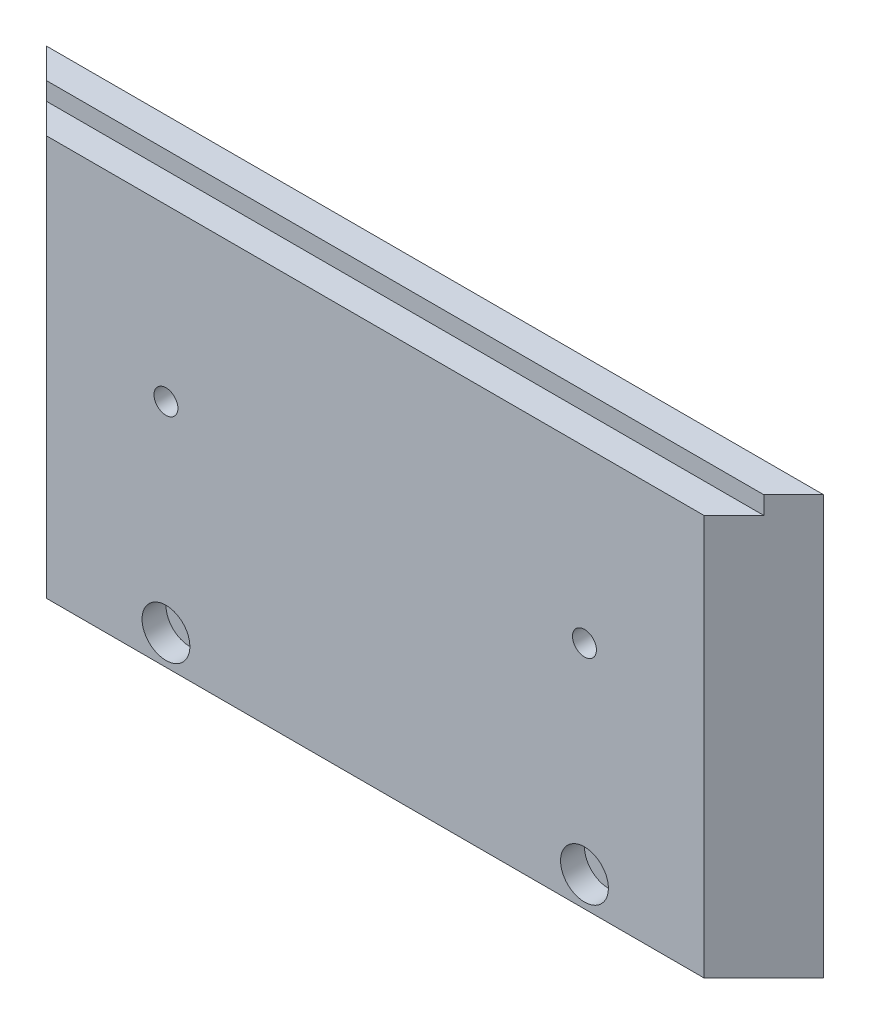
ISO-10303-21;
HEADER;
FILE_DESCRIPTION(('STEP AP214'),'2;1');
FILE_NAME('part.step','',(''),(''),'','','');
FILE_SCHEMA(('AUTOMOTIVE_DESIGN { 1 0 10303 214 1 1 1 1 }'));
ENDSEC;
DATA;
#1=APPLICATION_CONTEXT('core data for automotive mechanical design processes');
#2=APPLICATION_PROTOCOL_DEFINITION('international standard','automotive_design',2000,#1);
#3=PRODUCT_CONTEXT('',#1,'mechanical');
#4=PRODUCT('Part','Part','',(#3));
#5=PRODUCT_RELATED_PRODUCT_CATEGORY('part','',(#4));
#6=PRODUCT_DEFINITION_FORMATION('','',#4);
#7=PRODUCT_DEFINITION_CONTEXT('part definition',#1,'design');
#8=PRODUCT_DEFINITION('design','',#6,#7);
#9=PRODUCT_DEFINITION_SHAPE('','',#8);
#10=(LENGTH_UNIT() NAMED_UNIT(*) SI_UNIT(.MILLI.,.METRE.));
#11=(NAMED_UNIT(*) PLANE_ANGLE_UNIT() SI_UNIT($,.RADIAN.));
#12=(NAMED_UNIT(*) SI_UNIT($,.STERADIAN.) SOLID_ANGLE_UNIT());
#13=UNCERTAINTY_MEASURE_WITH_UNIT(LENGTH_MEASURE(1.E-05),#10,'distance_accuracy_value','');
#14=(GEOMETRIC_REPRESENTATION_CONTEXT(3) GLOBAL_UNCERTAINTY_ASSIGNED_CONTEXT((#13)) GLOBAL_UNIT_ASSIGNED_CONTEXT((#10,
#11,#12)) REPRESENTATION_CONTEXT('',''));
#15=CARTESIAN_POINT('',(0.,0.,0.));
#16=DIRECTION('',(0.,0.,1.));
#17=DIRECTION('',(1.,0.,0.));
#18=AXIS2_PLACEMENT_3D('',#15,#16,#17);
#19=CARTESIAN_POINT('',(0.,70.,0.));
#20=DIRECTION('',(0.,0.,-1.));
#21=DIRECTION('',(-1.,0.,0.));
#22=AXIS2_PLACEMENT_3D('',#19,#20,#21);
#23=PLANE('',#22);
#24=CARTESIAN_POINT('',(30.,38.5,0.));
#25=DIRECTION('',(0.,0.,1.));
#26=DIRECTION('',(1.,0.,0.));
#27=AXIS2_PLACEMENT_3D('',#24,#25,#26);
#28=CIRCLE('',#27,2.);
#29=CARTESIAN_POINT('',(32.,38.5,0.));
#30=VERTEX_POINT('',#29);
#31=EDGE_CURVE('E149',#30,#30,#28,.T.);
#32=ORIENTED_EDGE('',*,*,#31,.F.);
#33=EDGE_LOOP('',(#32));
#34=FACE_BOUND('',#33,.T.);
#35=CARTESIAN_POINT('',(100.,38.5,0.));
#36=DIRECTION('',(0.,0.,1.));
#37=DIRECTION('',(1.,0.,0.));
#38=AXIS2_PLACEMENT_3D('',#35,#36,#37);
#39=CIRCLE('',#38,2.);
#40=CARTESIAN_POINT('',(102.,38.5,0.));
#41=VERTEX_POINT('',#40);
#42=EDGE_CURVE('E146',#41,#41,#39,.T.);
#43=ORIENTED_EDGE('',*,*,#42,.F.);
#44=EDGE_LOOP('',(#43));
#45=FACE_BOUND('',#44,.T.);
#46=CARTESIAN_POINT('',(30.,5.,0.));
#47=DIRECTION('',(0.,0.,1.));
#48=DIRECTION('',(1.,0.,0.));
#49=AXIS2_PLACEMENT_3D('',#46,#47,#48);
#50=CIRCLE('',#49,4.00000000000001);
#51=CARTESIAN_POINT('',(34.,5.,0.));
#52=VERTEX_POINT('',#51);
#53=EDGE_CURVE('E138',#52,#52,#50,.T.);
#54=ORIENTED_EDGE('',*,*,#53,.F.);
#55=EDGE_LOOP('',(#54));
#56=FACE_BOUND('',#55,.T.);
#57=CARTESIAN_POINT('',(100.,5.,0.));
#58=DIRECTION('',(0.,0.,1.));
#59=DIRECTION('',(1.,0.,0.));
#60=AXIS2_PLACEMENT_3D('',#57,#58,#59);
#61=CIRCLE('',#60,4.00000000000001);
#62=CARTESIAN_POINT('',(104.,5.,0.));
#63=VERTEX_POINT('',#62);
#64=EDGE_CURVE('E131',#63,#63,#61,.T.);
#65=ORIENTED_EDGE('',*,*,#64,.F.);
#66=EDGE_LOOP('',(#65));
#67=FACE_BOUND('',#66,.T.);
#68=DIRECTION('',(1.,0.,0.));
#69=VECTOR('',#68,1.);
#70=CARTESIAN_POINT('',(0.,67.,0.));
#71=LINE('',#70,#69);
#72=CARTESIAN_POINT('',(10.,67.,0.));
#73=VERTEX_POINT('',#72);
#74=CARTESIAN_POINT('',(120.,67.,0.));
#75=VERTEX_POINT('',#74);
#76=EDGE_CURVE('E122',#73,#75,#71,.T.);
#77=ORIENTED_EDGE('',*,*,#76,.F.);
#78=DIRECTION('',(0.,-1.,0.));
#79=VECTOR('',#78,1.);
#80=CARTESIAN_POINT('',(10.,70.,0.));
#81=LINE('',#80,#79);
#82=CARTESIAN_POINT('',(10.,0.,0.));
#83=VERTEX_POINT('',#82);
#84=EDGE_CURVE('E86',#73,#83,#81,.T.);
#85=ORIENTED_EDGE('',*,*,#84,.T.);
#86=DIRECTION('',(1.,0.,0.));
#87=VECTOR('',#86,1.);
#88=CARTESIAN_POINT('',(0.,0.,0.));
#89=LINE('',#88,#87);
#90=CARTESIAN_POINT('',(120.,0.,0.));
#91=VERTEX_POINT('',#90);
#92=EDGE_CURVE('E90',#83,#91,#89,.T.);
#93=ORIENTED_EDGE('',*,*,#92,.T.);
#94=DIRECTION('',(0.,-1.,0.));
#95=VECTOR('',#94,1.);
#96=CARTESIAN_POINT('',(120.,70.,0.));
#97=LINE('',#96,#95);
#98=EDGE_CURVE('E76',#75,#91,#97,.T.);
#99=ORIENTED_EDGE('',*,*,#98,.F.);
#100=EDGE_LOOP('',(#77,#85,#93,#99));
#101=FACE_BOUND('',#100,.T.);
#102=ADVANCED_FACE('F33',(#34,#45,#56,#67,#101),#23,.F.);
#103=CARTESIAN_POINT('',(60.0000000000011,70.,60.0000000000001));
#104=DIRECTION('',(0.707106781186554,0.,0.707106781186541));
#105=DIRECTION('',(0.707106781186541,0.,-0.707106781186554));
#106=AXIS2_PLACEMENT_3D('',#103,#104,#105);
#107=PLANE('',#106);
#108=DIRECTION('',(0.,-1.,0.));
#109=VECTOR('',#108,1.);
#110=CARTESIAN_POINT('',(125.,70.000012,-5.));
#111=LINE('',#110,#109);
#112=CARTESIAN_POINT('',(125.,70.,-5.));
#113=VERTEX_POINT('',#112);
#114=CARTESIAN_POINT('',(125.,67.,-5.));
#115=VERTEX_POINT('',#114);
#116=EDGE_CURVE('E47',#113,#115,#111,.T.);
#117=ORIENTED_EDGE('',*,*,#116,.T.);
#118=DIRECTION('',(0.707106781186541,0.,-0.707106781186554));
#119=VECTOR('',#118,1.);
#120=CARTESIAN_POINT('',(60.0000000000012,67.,60.0000000000001));
#121=LINE('',#120,#119);
#122=EDGE_CURVE('E83',#75,#115,#121,.T.);
#123=ORIENTED_EDGE('',*,*,#122,.F.);
#124=ORIENTED_EDGE('',*,*,#98,.T.);
#125=DIRECTION('',(-0.707106781186541,0.,0.707106781186554));
#126=VECTOR('',#125,1.);
#127=CARTESIAN_POINT('',(60.0000000000011,0.,60.0000000000001));
#128=LINE('',#127,#126);
#129=CARTESIAN_POINT('',(130.,0.,-10.));
#130=VERTEX_POINT('',#129);
#131=EDGE_CURVE('E79',#130,#91,#128,.T.);
#132=ORIENTED_EDGE('',*,*,#131,.F.);
#133=DIRECTION('',(0.,-1.,0.));
#134=VECTOR('',#133,1.);
#135=CARTESIAN_POINT('',(130.,70.,-10.));
#136=LINE('',#135,#134);
#137=CARTESIAN_POINT('',(130.,70.,-10.));
#138=VERTEX_POINT('',#137);
#139=EDGE_CURVE('E41',#138,#130,#136,.T.);
#140=ORIENTED_EDGE('',*,*,#139,.F.);
#141=DIRECTION('',(-0.707106781186541,0.,0.707106781186554));
#142=VECTOR('',#141,1.);
#143=CARTESIAN_POINT('',(60.0000000000011,70.,60.0000000000001));
#144=LINE('',#143,#142);
#145=EDGE_CURVE('E95',#138,#113,#144,.T.);
#146=ORIENTED_EDGE('',*,*,#145,.T.);
#147=EDGE_LOOP('',(#117,#123,#124,#132,#140,#146));
#148=FACE_BOUND('',#147,.T.);
#149=ADVANCED_FACE('F35',(#148),#107,.T.);
#150=CARTESIAN_POINT('',(0.,70.,-10.));
#151=DIRECTION('',(0.,0.,-1.));
#152=DIRECTION('',(-1.,0.,0.));
#153=AXIS2_PLACEMENT_3D('',#150,#151,#152);
#154=PLANE('',#153);
#155=DIRECTION('',(1.,0.,0.));
#156=VECTOR('',#155,1.);
#157=CARTESIAN_POINT('',(0.,0.,-10.));
#158=LINE('',#157,#156);
#159=CARTESIAN_POINT('',(0.,0.,-10.));
#160=VERTEX_POINT('',#159);
#161=EDGE_CURVE('E99',#160,#130,#158,.T.);
#162=ORIENTED_EDGE('',*,*,#161,.F.);
#163=DIRECTION('',(0.,-1.,0.));
#164=VECTOR('',#163,1.);
#165=CARTESIAN_POINT('',(0.,70.,-10.));
#166=LINE('',#165,#164);
#167=CARTESIAN_POINT('',(0.,70.,-10.));
#168=VERTEX_POINT('',#167);
#169=EDGE_CURVE('E56',#168,#160,#166,.T.);
#170=ORIENTED_EDGE('',*,*,#169,.F.);
#171=DIRECTION('',(1.,0.,0.));
#172=VECTOR('',#171,1.);
#173=CARTESIAN_POINT('',(0.,70.,-10.));
#174=LINE('',#173,#172);
#175=EDGE_CURVE('E112',#168,#138,#174,.T.);
#176=ORIENTED_EDGE('',*,*,#175,.T.);
#177=ORIENTED_EDGE('',*,*,#139,.T.);
#178=EDGE_LOOP('',(#162,#170,#176,#177));
#179=FACE_BOUND('',#178,.T.);
#180=ADVANCED_FACE('F110',(#179),#154,.T.);
#181=CARTESIAN_POINT('',(5.,70.,-5.));
#182=DIRECTION('',(0.707106781186548,0.,-0.707106781186548));
#183=DIRECTION('',(-0.707106781186548,0.,-0.707106781186548));
#184=AXIS2_PLACEMENT_3D('',#181,#182,#183);
#185=PLANE('',#184);
#186=DIRECTION('',(0.707106781186548,0.,0.707106781186548));
#187=VECTOR('',#186,1.);
#188=CARTESIAN_POINT('',(5.,67.,-5.));
#189=LINE('',#188,#187);
#190=CARTESIAN_POINT('',(5.,67.,-5.));
#191=VERTEX_POINT('',#190);
#192=EDGE_CURVE('E125',#191,#73,#189,.T.);
#193=ORIENTED_EDGE('',*,*,#192,.F.);
#194=DIRECTION('',(0.,-1.,0.));
#195=VECTOR('',#194,1.);
#196=CARTESIAN_POINT('',(5.,70.000012,-5.));
#197=LINE('',#196,#195);
#198=CARTESIAN_POINT('',(5.,70.,-5.));
#199=VERTEX_POINT('',#198);
#200=EDGE_CURVE('E100',#199,#191,#197,.T.);
#201=ORIENTED_EDGE('',*,*,#200,.F.);
#202=DIRECTION('',(0.707106781186548,0.,0.707106781186548));
#203=VECTOR('',#202,1.);
#204=CARTESIAN_POINT('',(5.,70.,-5.));
#205=LINE('',#204,#203);
#206=EDGE_CURVE('E87',#168,#199,#205,.T.);
#207=ORIENTED_EDGE('',*,*,#206,.F.);
#208=ORIENTED_EDGE('',*,*,#169,.T.);
#209=DIRECTION('',(0.707106781186548,0.,0.707106781186548));
#210=VECTOR('',#209,1.);
#211=CARTESIAN_POINT('',(5.,0.,-5.));
#212=LINE('',#211,#210);
#213=EDGE_CURVE('E96',#160,#83,#212,.T.);
#214=ORIENTED_EDGE('',*,*,#213,.T.);
#215=ORIENTED_EDGE('',*,*,#84,.F.);
#216=EDGE_LOOP('',(#193,#201,#207,#208,#214,#215));
#217=FACE_BOUND('',#216,.T.);
#218=ADVANCED_FACE('F196',(#217),#185,.F.);
#219=CARTESIAN_POINT('',(0.,70.,0.));
#220=DIRECTION('',(0.,1.,0.));
#221=DIRECTION('',(0.,0.,1.));
#222=AXIS2_PLACEMENT_3D('',#219,#220,#221);
#223=PLANE('',#222);
#224=DIRECTION('',(-1.,0.,0.));
#225=VECTOR('',#224,1.);
#226=CARTESIAN_POINT('',(0.,70.,-5.));
#227=LINE('',#226,#225);
#228=EDGE_CURVE('E11',#113,#199,#227,.T.);
#229=ORIENTED_EDGE('',*,*,#228,.F.);
#230=ORIENTED_EDGE('',*,*,#145,.F.);
#231=ORIENTED_EDGE('',*,*,#175,.F.);
#232=ORIENTED_EDGE('',*,*,#206,.T.);
#233=EDGE_LOOP('',(#229,#230,#231,#232));
#234=FACE_BOUND('',#233,.T.);
#235=ADVANCED_FACE('F116',(#234),#223,.T.);
#236=CARTESIAN_POINT('',(0.,0.,0.));
#237=DIRECTION('',(0.,1.,0.));
#238=DIRECTION('',(0.,0.,1.));
#239=AXIS2_PLACEMENT_3D('',#236,#237,#238);
#240=PLANE('',#239);
#241=ORIENTED_EDGE('',*,*,#131,.T.);
#242=ORIENTED_EDGE('',*,*,#92,.F.);
#243=ORIENTED_EDGE('',*,*,#213,.F.);
#244=ORIENTED_EDGE('',*,*,#161,.T.);
#245=EDGE_LOOP('',(#241,#242,#243,#244));
#246=FACE_BOUND('',#245,.T.);
#247=ADVANCED_FACE('F98',(#246),#240,.F.);
#248=CARTESIAN_POINT('',(0.,70.000012,-5.));
#249=DIRECTION('',(0.,0.,-1.));
#250=DIRECTION('',(-1.,0.,0.));
#251=AXIS2_PLACEMENT_3D('',#248,#249,#250);
#252=PLANE('',#251);
#253=ORIENTED_EDGE('',*,*,#228,.T.);
#254=ORIENTED_EDGE('',*,*,#200,.T.);
#255=DIRECTION('',(1.,0.,0.));
#256=VECTOR('',#255,1.);
#257=CARTESIAN_POINT('',(0.,67.,-5.));
#258=LINE('',#257,#256);
#259=EDGE_CURVE('E128',#191,#115,#258,.T.);
#260=ORIENTED_EDGE('',*,*,#259,.T.);
#261=ORIENTED_EDGE('',*,*,#116,.F.);
#262=EDGE_LOOP('',(#253,#254,#260,#261));
#263=FACE_BOUND('',#262,.T.);
#264=ADVANCED_FACE('F186',(#263),#252,.F.);
#265=CARTESIAN_POINT('',(0.,67.,0.));
#266=DIRECTION('',(0.,1.,0.));
#267=DIRECTION('',(0.,0.,1.));
#268=AXIS2_PLACEMENT_3D('',#265,#266,#267);
#269=PLANE('',#268);
#270=ORIENTED_EDGE('',*,*,#259,.F.);
#271=ORIENTED_EDGE('',*,*,#192,.T.);
#272=ORIENTED_EDGE('',*,*,#76,.T.);
#273=ORIENTED_EDGE('',*,*,#122,.T.);
#274=EDGE_LOOP('',(#270,#271,#272,#273));
#275=FACE_BOUND('',#274,.T.);
#276=ADVANCED_FACE('F176',(#275),#269,.T.);
#277=CARTESIAN_POINT('',(100.,5.,-4.));
#278=DIRECTION('',(0.,0.,1.));
#279=DIRECTION('',(1.,0.,0.));
#280=AXIS2_PLACEMENT_3D('',#277,#278,#279);
#281=CYLINDRICAL_SURFACE('',#280,4.00000000000001);
#282=CARTESIAN_POINT('',(100.,5.,-4.));
#283=DIRECTION('',(0.,0.,1.));
#284=DIRECTION('',(1.,0.,0.));
#285=AXIS2_PLACEMENT_3D('',#282,#283,#284);
#286=CIRCLE('',#285,4.00000000000001);
#287=CARTESIAN_POINT('',(104.,5.,-4.));
#288=VERTEX_POINT('',#287);
#289=EDGE_CURVE('E134',#288,#288,#286,.T.);
#290=ORIENTED_EDGE('',*,*,#289,.F.);
#291=EDGE_LOOP('',(#290));
#292=FACE_BOUND('',#291,.T.);
#293=ORIENTED_EDGE('',*,*,#64,.T.);
#294=EDGE_LOOP('',(#293));
#295=FACE_BOUND('',#294,.T.);
#296=ADVANCED_FACE('F173',(#292,#295),#281,.F.);
#297=CARTESIAN_POINT('',(100.,5.,-4.));
#298=DIRECTION('',(0.,0.,1.));
#299=DIRECTION('',(1.,0.,0.));
#300=AXIS2_PLACEMENT_3D('',#297,#298,#299);
#301=PLANE('',#300);
#302=ORIENTED_EDGE('',*,*,#289,.T.);
#303=EDGE_LOOP('',(#302));
#304=FACE_BOUND('',#303,.T.);
#305=ADVANCED_FACE('F175',(#304),#301,.T.);
#306=CARTESIAN_POINT('',(30.,5.,-4.));
#307=DIRECTION('',(0.,0.,1.));
#308=DIRECTION('',(1.,0.,0.));
#309=AXIS2_PLACEMENT_3D('',#306,#307,#308);
#310=CYLINDRICAL_SURFACE('',#309,4.00000000000001);
#311=CARTESIAN_POINT('',(30.,5.,-4.));
#312=DIRECTION('',(0.,0.,1.));
#313=DIRECTION('',(1.,0.,0.));
#314=AXIS2_PLACEMENT_3D('',#311,#312,#313);
#315=CIRCLE('',#314,4.00000000000001);
#316=CARTESIAN_POINT('',(34.,5.,-4.));
#317=VERTEX_POINT('',#316);
#318=EDGE_CURVE('E130',#317,#317,#315,.T.);
#319=ORIENTED_EDGE('',*,*,#318,.F.);
#320=EDGE_LOOP('',(#319));
#321=FACE_BOUND('',#320,.T.);
#322=ORIENTED_EDGE('',*,*,#53,.T.);
#323=EDGE_LOOP('',(#322));
#324=FACE_BOUND('',#323,.T.);
#325=ADVANCED_FACE('F183',(#321,#324),#310,.F.);
#326=CARTESIAN_POINT('',(30.,5.,-4.));
#327=DIRECTION('',(0.,0.,1.));
#328=DIRECTION('',(1.,0.,0.));
#329=AXIS2_PLACEMENT_3D('',#326,#327,#328);
#330=PLANE('',#329);
#331=ORIENTED_EDGE('',*,*,#318,.T.);
#332=EDGE_LOOP('',(#331));
#333=FACE_BOUND('',#332,.T.);
#334=ADVANCED_FACE('F221',(#333),#330,.T.);
#335=CARTESIAN_POINT('',(100.,38.5,-4.));
#336=DIRECTION('',(0.,0.,1.));
#337=DIRECTION('',(1.,0.,0.));
#338=AXIS2_PLACEMENT_3D('',#335,#336,#337);
#339=CYLINDRICAL_SURFACE('',#338,2.);
#340=CARTESIAN_POINT('',(100.,38.5,-4.));
#341=DIRECTION('',(0.,0.,1.));
#342=DIRECTION('',(1.,0.,0.));
#343=AXIS2_PLACEMENT_3D('',#340,#341,#342);
#344=CIRCLE('',#343,2.);
#345=CARTESIAN_POINT('',(102.,38.5,-4.));
#346=VERTEX_POINT('',#345);
#347=EDGE_CURVE('E143',#346,#346,#344,.T.);
#348=ORIENTED_EDGE('',*,*,#347,.F.);
#349=EDGE_LOOP('',(#348));
#350=FACE_BOUND('',#349,.T.);
#351=ORIENTED_EDGE('',*,*,#42,.T.);
#352=EDGE_LOOP('',(#351));
#353=FACE_BOUND('',#352,.T.);
#354=ADVANCED_FACE('F226',(#350,#353),#339,.F.);
#355=CARTESIAN_POINT('',(100.,38.5,-4.));
#356=DIRECTION('',(0.,0.,1.));
#357=DIRECTION('',(1.,0.,0.));
#358=AXIS2_PLACEMENT_3D('',#355,#356,#357);
#359=PLANE('',#358);
#360=ORIENTED_EDGE('',*,*,#347,.T.);
#361=EDGE_LOOP('',(#360));
#362=FACE_BOUND('',#361,.T.);
#363=ADVANCED_FACE('F160',(#362),#359,.T.);
#364=CARTESIAN_POINT('',(30.,38.5,-4.));
#365=DIRECTION('',(0.,0.,1.));
#366=DIRECTION('',(1.,0.,0.));
#367=AXIS2_PLACEMENT_3D('',#364,#365,#366);
#368=CYLINDRICAL_SURFACE('',#367,2.);
#369=CARTESIAN_POINT('',(30.,38.5,-4.));
#370=DIRECTION('',(0.,0.,1.));
#371=DIRECTION('',(1.,0.,0.));
#372=AXIS2_PLACEMENT_3D('',#369,#370,#371);
#373=CIRCLE('',#372,2.);
#374=CARTESIAN_POINT('',(32.,38.5,-4.));
#375=VERTEX_POINT('',#374);
#376=EDGE_CURVE('E135',#375,#375,#373,.T.);
#377=ORIENTED_EDGE('',*,*,#376,.F.);
#378=EDGE_LOOP('',(#377));
#379=FACE_BOUND('',#378,.T.);
#380=ORIENTED_EDGE('',*,*,#31,.T.);
#381=EDGE_LOOP('',(#380));
#382=FACE_BOUND('',#381,.T.);
#383=ADVANCED_FACE('F157',(#379,#382),#368,.F.);
#384=CARTESIAN_POINT('',(30.,38.5,-4.));
#385=DIRECTION('',(0.,0.,1.));
#386=DIRECTION('',(1.,0.,0.));
#387=AXIS2_PLACEMENT_3D('',#384,#385,#386);
#388=PLANE('',#387);
#389=ORIENTED_EDGE('',*,*,#376,.T.);
#390=EDGE_LOOP('',(#389));
#391=FACE_BOUND('',#390,.T.);
#392=ADVANCED_FACE('F155',(#391),#388,.T.);
#393=CLOSED_SHELL('',(#102,#149,#180,#218,#235,#247,#264,#276,#296,#305,#325,#334,#354,#363,
#383,#392));
#394=MANIFOLD_SOLID_BREP('B2',#393);
#395=ADVANCED_BREP_SHAPE_REPRESENTATION('',(#18,#394),#14);
#396=SHAPE_DEFINITION_REPRESENTATION(#9,#395);
ENDSEC;
END-ISO-10303-21;
